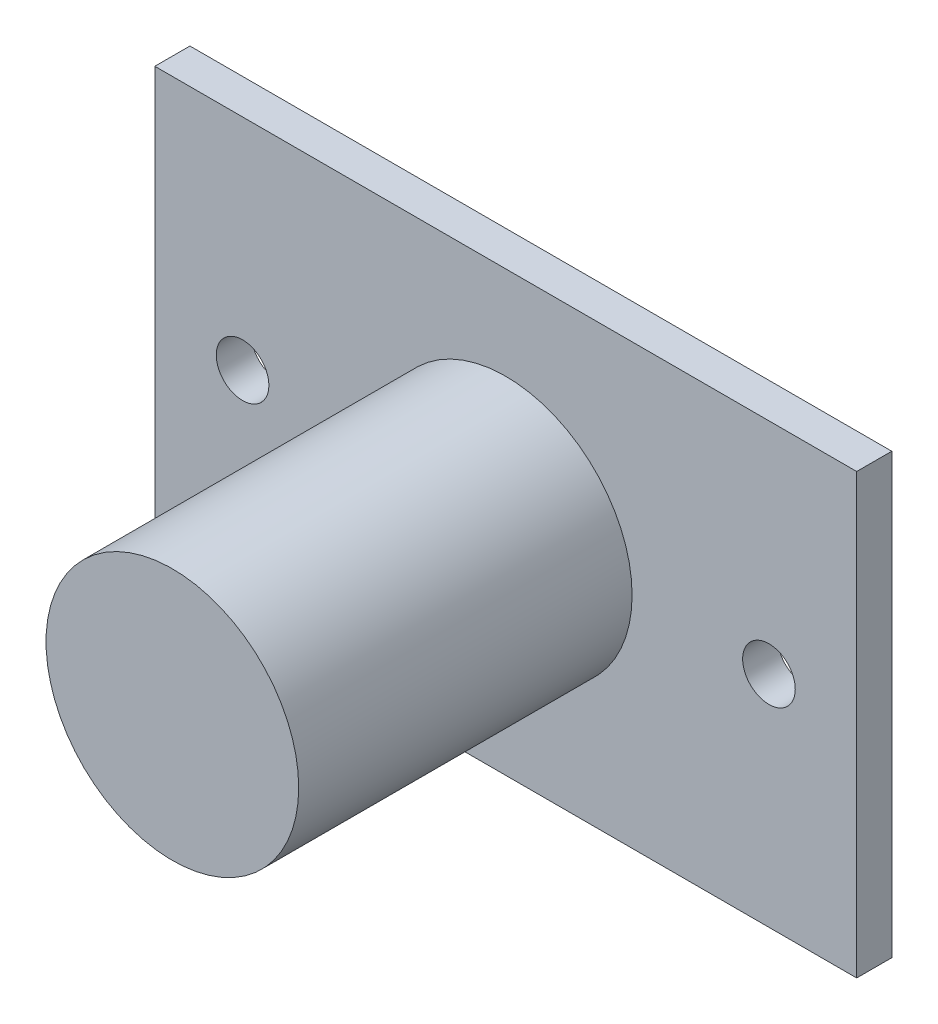
ISO-10303-21;
HEADER;
FILE_DESCRIPTION(('STEP AP214'),'2;1');
FILE_NAME('part.step','',(''),(''),'','','');
FILE_SCHEMA(('AUTOMOTIVE_DESIGN { 1 0 10303 214 1 1 1 1 }'));
ENDSEC;
DATA;
#1=APPLICATION_CONTEXT('core data for automotive mechanical design processes');
#2=APPLICATION_PROTOCOL_DEFINITION('international standard','automotive_design',2000,#1);
#3=PRODUCT_CONTEXT('',#1,'mechanical');
#4=PRODUCT('Part','Part','',(#3));
#5=PRODUCT_RELATED_PRODUCT_CATEGORY('part','',(#4));
#6=PRODUCT_DEFINITION_FORMATION('','',#4);
#7=PRODUCT_DEFINITION_CONTEXT('part definition',#1,'design');
#8=PRODUCT_DEFINITION('design','',#6,#7);
#9=PRODUCT_DEFINITION_SHAPE('','',#8);
#10=(LENGTH_UNIT() NAMED_UNIT(*) SI_UNIT(.MILLI.,.METRE.));
#11=(NAMED_UNIT(*) PLANE_ANGLE_UNIT() SI_UNIT($,.RADIAN.));
#12=(NAMED_UNIT(*) SI_UNIT($,.STERADIAN.) SOLID_ANGLE_UNIT());
#13=UNCERTAINTY_MEASURE_WITH_UNIT(LENGTH_MEASURE(1.E-05),#10,'distance_accuracy_value','');
#14=(GEOMETRIC_REPRESENTATION_CONTEXT(3) GLOBAL_UNCERTAINTY_ASSIGNED_CONTEXT((#13)) GLOBAL_UNIT_ASSIGNED_CONTEXT((#10,
#11,#12)) REPRESENTATION_CONTEXT('',''));
#15=CARTESIAN_POINT('',(0.,0.,0.));
#16=DIRECTION('',(0.,0.,1.));
#17=DIRECTION('',(1.,0.,0.));
#18=AXIS2_PLACEMENT_3D('',#15,#16,#17);
#19=CARTESIAN_POINT('',(0.,0.,2.));
#20=DIRECTION('',(0.,0.,-1.));
#21=DIRECTION('',(-1.,0.,0.));
#22=AXIS2_PLACEMENT_3D('',#19,#20,#21);
#23=PLANE('',#22);
#24=CARTESIAN_POINT('',(0.,0.,2.));
#25=DIRECTION('',(0.,0.,1.));
#26=DIRECTION('',(1.,0.,0.));
#27=AXIS2_PLACEMENT_3D('',#24,#25,#26);
#28=CIRCLE('',#27,7.2);
#29=CARTESIAN_POINT('',(7.2,0.,2.));
#30=VERTEX_POINT('',#29);
#31=EDGE_CURVE('E11',#30,#30,#28,.T.);
#32=ORIENTED_EDGE('',*,*,#31,.F.);
#33=EDGE_LOOP('',(#32));
#34=FACE_BOUND('',#33,.T.);
#35=DIRECTION('',(0.,-1.,0.));
#36=VECTOR('',#35,1.);
#37=CARTESIAN_POINT('',(-20.,12.5,2.));
#38=LINE('',#37,#36);
#39=CARTESIAN_POINT('',(-20.,12.5,2.));
#40=VERTEX_POINT('',#39);
#41=CARTESIAN_POINT('',(-20.,-12.5,2.));
#42=VERTEX_POINT('',#41);
#43=EDGE_CURVE('E95',#40,#42,#38,.T.);
#44=ORIENTED_EDGE('',*,*,#43,.T.);
#45=DIRECTION('',(1.,0.,0.));
#46=VECTOR('',#45,1.);
#47=CARTESIAN_POINT('',(20.,-12.5,2.));
#48=LINE('',#47,#46);
#49=CARTESIAN_POINT('',(20.,-12.5,2.));
#50=VERTEX_POINT('',#49);
#51=EDGE_CURVE('E90',#42,#50,#48,.T.);
#52=ORIENTED_EDGE('',*,*,#51,.T.);
#53=DIRECTION('',(0.,1.,0.));
#54=VECTOR('',#53,1.);
#55=CARTESIAN_POINT('',(20.,12.5,2.));
#56=LINE('',#55,#54);
#57=CARTESIAN_POINT('',(20.,12.5,2.));
#58=VERTEX_POINT('',#57);
#59=EDGE_CURVE('E93',#50,#58,#56,.T.);
#60=ORIENTED_EDGE('',*,*,#59,.T.);
#61=DIRECTION('',(-1.,0.,0.));
#62=VECTOR('',#61,1.);
#63=CARTESIAN_POINT('',(20.,12.5,2.));
#64=LINE('',#63,#62);
#65=EDGE_CURVE('E59',#58,#40,#64,.T.);
#66=ORIENTED_EDGE('',*,*,#65,.T.);
#67=EDGE_LOOP('',(#44,#52,#60,#66));
#68=FACE_BOUND('',#67,.T.);
#69=CARTESIAN_POINT('',(15.,0.,2.));
#70=DIRECTION('',(0.,0.,1.));
#71=DIRECTION('',(1.,0.,0.));
#72=AXIS2_PLACEMENT_3D('',#69,#70,#71);
#73=CIRCLE('',#72,1.5);
#74=CARTESIAN_POINT('',(16.5,0.,2.));
#75=VERTEX_POINT('',#74);
#76=EDGE_CURVE('E111',#75,#75,#73,.T.);
#77=ORIENTED_EDGE('',*,*,#76,.F.);
#78=EDGE_LOOP('',(#77));
#79=FACE_BOUND('',#78,.T.);
#80=CARTESIAN_POINT('',(-15.,0.,2.));
#81=DIRECTION('',(0.,0.,1.));
#82=DIRECTION('',(1.,0.,0.));
#83=AXIS2_PLACEMENT_3D('',#80,#81,#82);
#84=CIRCLE('',#83,1.5);
#85=CARTESIAN_POINT('',(-13.5,0.,2.));
#86=VERTEX_POINT('',#85);
#87=EDGE_CURVE('E126',#86,#86,#84,.T.);
#88=ORIENTED_EDGE('',*,*,#87,.F.);
#89=EDGE_LOOP('',(#88));
#90=FACE_BOUND('',#89,.T.);
#91=ADVANCED_FACE('F41',(#34,#68,#79,#90),#23,.F.);
#92=CARTESIAN_POINT('',(0.,0.,0.));
#93=DIRECTION('',(0.,0.,-1.));
#94=DIRECTION('',(-1.,0.,0.));
#95=AXIS2_PLACEMENT_3D('',#92,#93,#94);
#96=PLANE('',#95);
#97=CARTESIAN_POINT('',(15.,0.,0.));
#98=DIRECTION('',(0.,0.,1.));
#99=DIRECTION('',(1.,0.,0.));
#100=AXIS2_PLACEMENT_3D('',#97,#98,#99);
#101=CIRCLE('',#100,1.5);
#102=CARTESIAN_POINT('',(16.5,0.,0.));
#103=VERTEX_POINT('',#102);
#104=EDGE_CURVE('E123',#103,#103,#101,.T.);
#105=ORIENTED_EDGE('',*,*,#104,.T.);
#106=EDGE_LOOP('',(#105));
#107=FACE_BOUND('',#106,.T.);
#108=DIRECTION('',(0.,-1.,0.));
#109=VECTOR('',#108,1.);
#110=CARTESIAN_POINT('',(-20.,12.5,0.));
#111=LINE('',#110,#109);
#112=CARTESIAN_POINT('',(-20.,12.5,0.));
#113=VERTEX_POINT('',#112);
#114=CARTESIAN_POINT('',(-20.,-12.5,0.));
#115=VERTEX_POINT('',#114);
#116=EDGE_CURVE('E108',#113,#115,#111,.T.);
#117=ORIENTED_EDGE('',*,*,#116,.F.);
#118=DIRECTION('',(-1.,0.,0.));
#119=VECTOR('',#118,1.);
#120=CARTESIAN_POINT('',(20.,12.5,0.));
#121=LINE('',#120,#119);
#122=CARTESIAN_POINT('',(20.,12.5,0.));
#123=VERTEX_POINT('',#122);
#124=EDGE_CURVE('E82',#123,#113,#121,.T.);
#125=ORIENTED_EDGE('',*,*,#124,.F.);
#126=DIRECTION('',(0.,1.,0.));
#127=VECTOR('',#126,1.);
#128=CARTESIAN_POINT('',(20.,12.5,0.));
#129=LINE('',#128,#127);
#130=CARTESIAN_POINT('',(20.,-12.5,0.));
#131=VERTEX_POINT('',#130);
#132=EDGE_CURVE('E76',#131,#123,#129,.T.);
#133=ORIENTED_EDGE('',*,*,#132,.F.);
#134=DIRECTION('',(1.,0.,0.));
#135=VECTOR('',#134,1.);
#136=CARTESIAN_POINT('',(20.,-12.5,0.));
#137=LINE('',#136,#135);
#138=EDGE_CURVE('E100',#115,#131,#137,.T.);
#139=ORIENTED_EDGE('',*,*,#138,.F.);
#140=EDGE_LOOP('',(#117,#125,#133,#139));
#141=FACE_BOUND('',#140,.T.);
#142=CARTESIAN_POINT('',(-15.,0.,0.));
#143=DIRECTION('',(0.,0.,1.));
#144=DIRECTION('',(1.,0.,0.));
#145=AXIS2_PLACEMENT_3D('',#142,#143,#144);
#146=CIRCLE('',#145,1.5);
#147=CARTESIAN_POINT('',(-13.5,0.,0.));
#148=VERTEX_POINT('',#147);
#149=EDGE_CURVE('E129',#148,#148,#146,.T.);
#150=ORIENTED_EDGE('',*,*,#149,.T.);
#151=EDGE_LOOP('',(#150));
#152=FACE_BOUND('',#151,.T.);
#153=ADVANCED_FACE('F119',(#107,#141,#152),#96,.T.);
#154=CARTESIAN_POINT('',(-20.,12.5,2.));
#155=DIRECTION('',(1.,0.,0.));
#156=DIRECTION('',(0.,1.,0.));
#157=AXIS2_PLACEMENT_3D('',#154,#155,#156);
#158=PLANE('',#157);
#159=ORIENTED_EDGE('',*,*,#116,.T.);
#160=DIRECTION('',(0.,0.,-1.));
#161=VECTOR('',#160,1.);
#162=CARTESIAN_POINT('',(-20.,-12.5,2.));
#163=LINE('',#162,#161);
#164=EDGE_CURVE('E45',#42,#115,#163,.T.);
#165=ORIENTED_EDGE('',*,*,#164,.F.);
#166=ORIENTED_EDGE('',*,*,#43,.F.);
#167=DIRECTION('',(0.,0.,-1.));
#168=VECTOR('',#167,1.);
#169=CARTESIAN_POINT('',(-20.,12.5,2.));
#170=LINE('',#169,#168);
#171=EDGE_CURVE('E104',#40,#113,#170,.T.);
#172=ORIENTED_EDGE('',*,*,#171,.T.);
#173=EDGE_LOOP('',(#159,#165,#166,#172));
#174=FACE_BOUND('',#173,.T.);
#175=ADVANCED_FACE('F43',(#174),#158,.F.);
#176=CARTESIAN_POINT('',(20.,-12.5,2.));
#177=DIRECTION('',(0.,1.,0.));
#178=DIRECTION('',(-1.,0.,0.));
#179=AXIS2_PLACEMENT_3D('',#176,#177,#178);
#180=PLANE('',#179);
#181=ORIENTED_EDGE('',*,*,#138,.T.);
#182=DIRECTION('',(0.,0.,-1.));
#183=VECTOR('',#182,1.);
#184=CARTESIAN_POINT('',(20.,-12.5,2.));
#185=LINE('',#184,#183);
#186=EDGE_CURVE('E98',#50,#131,#185,.T.);
#187=ORIENTED_EDGE('',*,*,#186,.F.);
#188=ORIENTED_EDGE('',*,*,#51,.F.);
#189=ORIENTED_EDGE('',*,*,#164,.T.);
#190=EDGE_LOOP('',(#181,#187,#188,#189));
#191=FACE_BOUND('',#190,.T.);
#192=ADVANCED_FACE('F99',(#191),#180,.F.);
#193=CARTESIAN_POINT('',(20.,12.5,2.));
#194=DIRECTION('',(-1.,0.,0.));
#195=DIRECTION('',(0.,0.,1.));
#196=AXIS2_PLACEMENT_3D('',#193,#194,#195);
#197=PLANE('',#196);
#198=ORIENTED_EDGE('',*,*,#132,.T.);
#199=DIRECTION('',(0.,0.,-1.));
#200=VECTOR('',#199,1.);
#201=CARTESIAN_POINT('',(20.,12.5,2.));
#202=LINE('',#201,#200);
#203=EDGE_CURVE('E101',#58,#123,#202,.T.);
#204=ORIENTED_EDGE('',*,*,#203,.F.);
#205=ORIENTED_EDGE('',*,*,#59,.F.);
#206=ORIENTED_EDGE('',*,*,#186,.T.);
#207=EDGE_LOOP('',(#198,#204,#205,#206));
#208=FACE_BOUND('',#207,.T.);
#209=ADVANCED_FACE('F102',(#208),#197,.F.);
#210=CARTESIAN_POINT('',(20.,12.5,2.));
#211=DIRECTION('',(0.,-1.,0.));
#212=DIRECTION('',(1.,0.,0.));
#213=AXIS2_PLACEMENT_3D('',#210,#211,#212);
#214=PLANE('',#213);
#215=ORIENTED_EDGE('',*,*,#124,.T.);
#216=ORIENTED_EDGE('',*,*,#171,.F.);
#217=ORIENTED_EDGE('',*,*,#65,.F.);
#218=ORIENTED_EDGE('',*,*,#203,.T.);
#219=EDGE_LOOP('',(#215,#216,#217,#218));
#220=FACE_BOUND('',#219,.T.);
#221=ADVANCED_FACE('F116',(#220),#214,.F.);
#222=CARTESIAN_POINT('',(15.,0.,2.));
#223=DIRECTION('',(0.,0.,-1.));
#224=DIRECTION('',(-1.,0.,0.));
#225=AXIS2_PLACEMENT_3D('',#222,#223,#224);
#226=CYLINDRICAL_SURFACE('',#225,1.5);
#227=ORIENTED_EDGE('',*,*,#76,.T.);
#228=EDGE_LOOP('',(#227));
#229=FACE_BOUND('',#228,.T.);
#230=ORIENTED_EDGE('',*,*,#104,.F.);
#231=EDGE_LOOP('',(#230));
#232=FACE_BOUND('',#231,.T.);
#233=ADVANCED_FACE('F156',(#229,#232),#226,.F.);
#234=CARTESIAN_POINT('',(-15.,0.,2.));
#235=DIRECTION('',(0.,0.,-1.));
#236=DIRECTION('',(-1.,0.,0.));
#237=AXIS2_PLACEMENT_3D('',#234,#235,#236);
#238=CYLINDRICAL_SURFACE('',#237,1.5);
#239=ORIENTED_EDGE('',*,*,#87,.T.);
#240=EDGE_LOOP('',(#239));
#241=FACE_BOUND('',#240,.T.);
#242=ORIENTED_EDGE('',*,*,#149,.F.);
#243=EDGE_LOOP('',(#242));
#244=FACE_BOUND('',#243,.T.);
#245=ADVANCED_FACE('F143',(#241,#244),#238,.F.);
#246=CARTESIAN_POINT('',(0.,0.,21.));
#247=DIRECTION('',(0.,0.,-1.));
#248=DIRECTION('',(-1.,0.,0.));
#249=AXIS2_PLACEMENT_3D('',#246,#247,#248);
#250=CYLINDRICAL_SURFACE('',#249,7.2);
#251=CARTESIAN_POINT('',(0.,0.,21.));
#252=DIRECTION('',(0.,0.,1.));
#253=DIRECTION('',(1.,0.,0.));
#254=AXIS2_PLACEMENT_3D('',#251,#252,#253);
#255=CIRCLE('',#254,7.2);
#256=CARTESIAN_POINT('',(7.2,0.,21.));
#257=VERTEX_POINT('',#256);
#258=EDGE_CURVE('E132',#257,#257,#255,.T.);
#259=ORIENTED_EDGE('',*,*,#258,.F.);
#260=EDGE_LOOP('',(#259));
#261=FACE_BOUND('',#260,.T.);
#262=ORIENTED_EDGE('',*,*,#31,.T.);
#263=EDGE_LOOP('',(#262));
#264=FACE_BOUND('',#263,.T.);
#265=ADVANCED_FACE('F140',(#261,#264),#250,.T.);
#266=CARTESIAN_POINT('',(0.,0.,21.));
#267=DIRECTION('',(0.,0.,1.));
#268=DIRECTION('',(1.,0.,0.));
#269=AXIS2_PLACEMENT_3D('',#266,#267,#268);
#270=PLANE('',#269);
#271=ORIENTED_EDGE('',*,*,#258,.T.);
#272=EDGE_LOOP('',(#271));
#273=FACE_BOUND('',#272,.T.);
#274=ADVANCED_FACE('F138',(#273),#270,.T.);
#275=CLOSED_SHELL('',(#91,#153,#175,#192,#209,#221,#233,#245,#265,#274));
#276=MANIFOLD_SOLID_BREP('B2',#275);
#277=ADVANCED_BREP_SHAPE_REPRESENTATION('',(#18,#276),#14);
#278=SHAPE_DEFINITION_REPRESENTATION(#9,#277);
ENDSEC;
END-ISO-10303-21;
